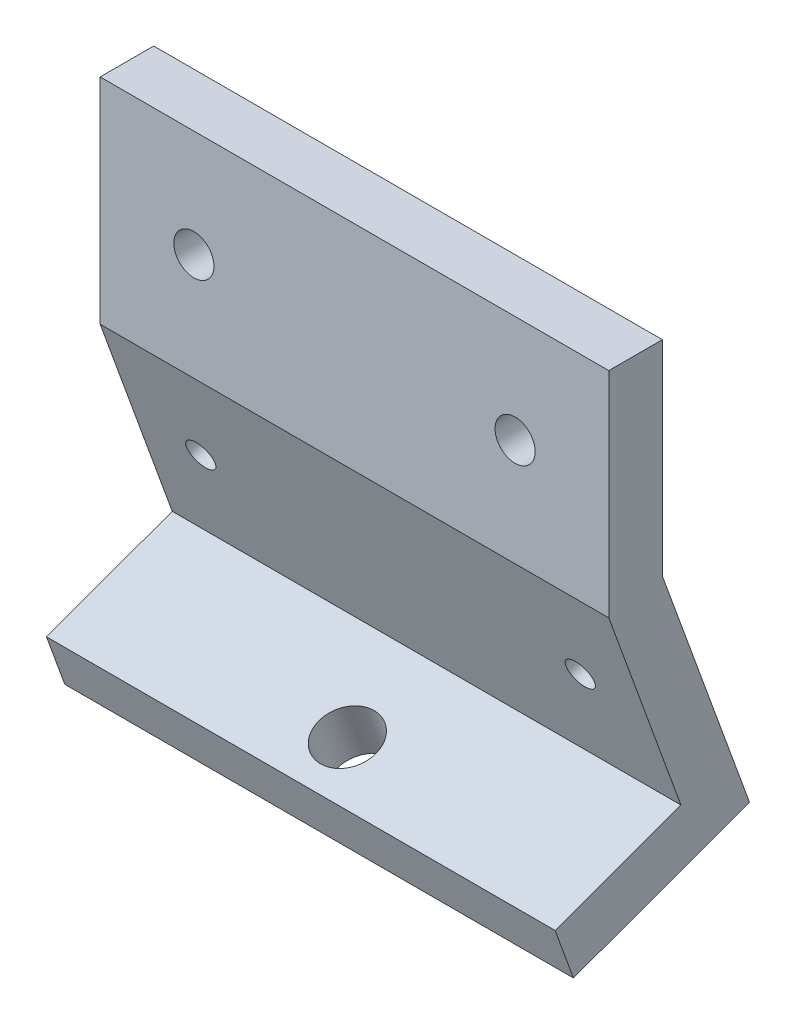
ISO-10303-21;
HEADER;
FILE_DESCRIPTION(('STEP AP214'),'2;1');
FILE_NAME('part.step','',(''),(''),'','','');
FILE_SCHEMA(('AUTOMOTIVE_DESIGN { 1 0 10303 214 1 1 1 1 }'));
ENDSEC;
DATA;
#1=APPLICATION_CONTEXT('core data for automotive mechanical design processes');
#2=APPLICATION_PROTOCOL_DEFINITION('international standard','automotive_design',2000,#1);
#3=PRODUCT_CONTEXT('',#1,'mechanical');
#4=PRODUCT('Part','Part','',(#3));
#5=PRODUCT_RELATED_PRODUCT_CATEGORY('part','',(#4));
#6=PRODUCT_DEFINITION_FORMATION('','',#4);
#7=PRODUCT_DEFINITION_CONTEXT('part definition',#1,'design');
#8=PRODUCT_DEFINITION('design','',#6,#7);
#9=PRODUCT_DEFINITION_SHAPE('','',#8);
#10=(LENGTH_UNIT() NAMED_UNIT(*) SI_UNIT(.MILLI.,.METRE.));
#11=(NAMED_UNIT(*) PLANE_ANGLE_UNIT() SI_UNIT($,.RADIAN.));
#12=(NAMED_UNIT(*) SI_UNIT($,.STERADIAN.) SOLID_ANGLE_UNIT());
#13=UNCERTAINTY_MEASURE_WITH_UNIT(LENGTH_MEASURE(1.E-05),#10,'distance_accuracy_value','');
#14=(GEOMETRIC_REPRESENTATION_CONTEXT(3) GLOBAL_UNCERTAINTY_ASSIGNED_CONTEXT((#13)) GLOBAL_UNIT_ASSIGNED_CONTEXT((#10,
#11,#12)) REPRESENTATION_CONTEXT('',''));
#15=CARTESIAN_POINT('',(0.,0.,0.));
#16=DIRECTION('',(0.,0.,1.));
#17=DIRECTION('',(1.,0.,0.));
#18=AXIS2_PLACEMENT_3D('',#15,#16,#17);
#19=CARTESIAN_POINT('',(30.1625,0.,0.));
#20=DIRECTION('',(0.,0.,-1.));
#21=DIRECTION('',(-1.,0.,0.));
#22=AXIS2_PLACEMENT_3D('',#19,#20,#21);
#23=PLANE('',#22);
#24=CARTESIAN_POINT('',(19.05,12.7,0.));
#25=DIRECTION('',(0.,0.,1.));
#26=DIRECTION('',(1.,0.,0.));
#27=AXIS2_PLACEMENT_3D('',#24,#25,#26);
#28=CIRCLE('',#27,2.38124999999999);
#29=CARTESIAN_POINT('',(21.43125,12.7,0.));
#30=VERTEX_POINT('',#29);
#31=EDGE_CURVE('E235',#30,#30,#28,.T.);
#32=ORIENTED_EDGE('',*,*,#31,.F.);
#33=EDGE_LOOP('',(#32));
#34=FACE_BOUND('',#33,.T.);
#35=DIRECTION('',(0.,-1.,0.));
#36=VECTOR('',#35,1.);
#37=CARTESIAN_POINT('',(-30.1625,0.,0.));
#38=LINE('',#37,#36);
#39=CARTESIAN_POINT('',(-30.1625,25.4,0.));
#40=VERTEX_POINT('',#39);
#41=CARTESIAN_POINT('',(-30.1625,0.,0.));
#42=VERTEX_POINT('',#41);
#43=EDGE_CURVE('E92',#40,#42,#38,.T.);
#44=ORIENTED_EDGE('',*,*,#43,.T.);
#45=DIRECTION('',(-1.,0.,0.));
#46=VECTOR('',#45,1.);
#47=CARTESIAN_POINT('',(30.1625,0.,0.));
#48=LINE('',#47,#46);
#49=CARTESIAN_POINT('',(30.1625,0.,0.));
#50=VERTEX_POINT('',#49);
#51=EDGE_CURVE('E137',#50,#42,#48,.T.);
#52=ORIENTED_EDGE('',*,*,#51,.F.);
#53=DIRECTION('',(0.,-1.,0.));
#54=VECTOR('',#53,1.);
#55=CARTESIAN_POINT('',(30.1625,0.,0.));
#56=LINE('',#55,#54);
#57=CARTESIAN_POINT('',(30.1625,25.4,0.));
#58=VERTEX_POINT('',#57);
#59=EDGE_CURVE('E57',#58,#50,#56,.T.);
#60=ORIENTED_EDGE('',*,*,#59,.F.);
#61=DIRECTION('',(-1.,0.,0.));
#62=VECTOR('',#61,1.);
#63=CARTESIAN_POINT('',(30.1625,25.4,0.));
#64=LINE('',#63,#62);
#65=EDGE_CURVE('E131',#58,#40,#64,.T.);
#66=ORIENTED_EDGE('',*,*,#65,.T.);
#67=EDGE_LOOP('',(#44,#52,#60,#66));
#68=FACE_BOUND('',#67,.T.);
#69=CARTESIAN_POINT('',(-19.05,12.7,0.));
#70=DIRECTION('',(0.,0.,1.));
#71=DIRECTION('',(1.,0.,0.));
#72=AXIS2_PLACEMENT_3D('',#69,#70,#71);
#73=CIRCLE('',#72,2.38124999999999);
#74=CARTESIAN_POINT('',(-16.66875,12.7,0.));
#75=VERTEX_POINT('',#74);
#76=EDGE_CURVE('E243',#75,#75,#73,.T.);
#77=ORIENTED_EDGE('',*,*,#76,.F.);
#78=EDGE_LOOP('',(#77));
#79=FACE_BOUND('',#78,.T.);
#80=ADVANCED_FACE('F39',(#34,#68,#79),#23,.F.);
#81=CARTESIAN_POINT('',(30.1625,-23.4923155196477,-8.55050358314173));
#82=DIRECTION('',(0.,0.342020143325669,-0.939692620785908));
#83=DIRECTION('',(0.,0.939692620785908,0.342020143325669));
#84=AXIS2_PLACEMENT_3D('',#81,#82,#83);
#85=PLANE('',#84);
#86=CARTESIAN_POINT('',(-22.5,-11.7461577598239,-4.27525179157087));
#87=DIRECTION('',(0.,-0.342020143325669,0.939692620785908));
#88=DIRECTION('',(0.,-0.939692620785908,-0.342020143325669));
#89=AXIS2_PLACEMENT_3D('',#86,#87,#88);
#90=CIRCLE('',#89,1.7);
#91=CARTESIAN_POINT('',(-22.5,-13.3436352151599,-4.85668603522451));
#92=VERTEX_POINT('',#91);
#93=EDGE_CURVE('E227',#92,#92,#90,.T.);
#94=ORIENTED_EDGE('',*,*,#93,.F.);
#95=EDGE_LOOP('',(#94));
#96=FACE_BOUND('',#95,.T.);
#97=DIRECTION('',(0.,-0.939692620785908,-0.342020143325669));
#98=VECTOR('',#97,1.);
#99=CARTESIAN_POINT('',(-30.1625,-23.4923155196477,-8.55050358314173));
#100=LINE('',#99,#98);
#101=CARTESIAN_POINT('',(-30.1625,-23.4923155196477,-8.55050358314173));
#102=VERTEX_POINT('',#101);
#103=EDGE_CURVE('E141',#42,#102,#100,.T.);
#104=ORIENTED_EDGE('',*,*,#103,.T.);
#105=DIRECTION('',(-1.,0.,0.));
#106=VECTOR('',#105,1.);
#107=CARTESIAN_POINT('',(30.1625,-23.4923155196477,-8.55050358314173));
#108=LINE('',#107,#106);
#109=CARTESIAN_POINT('',(30.1625,-23.4923155196477,-8.55050358314173));
#110=VERTEX_POINT('',#109);
#111=EDGE_CURVE('E11',#110,#102,#108,.T.);
#112=ORIENTED_EDGE('',*,*,#111,.F.);
#113=DIRECTION('',(0.,-0.939692620785908,-0.342020143325669));
#114=VECTOR('',#113,1.);
#115=CARTESIAN_POINT('',(30.1625,-23.4923155196477,-8.55050358314173));
#116=LINE('',#115,#114);
#117=EDGE_CURVE('E164',#50,#110,#116,.T.);
#118=ORIENTED_EDGE('',*,*,#117,.F.);
#119=ORIENTED_EDGE('',*,*,#51,.T.);
#120=EDGE_LOOP('',(#104,#112,#118,#119));
#121=FACE_BOUND('',#120,.T.);
#122=CARTESIAN_POINT('',(22.5,-11.7461577598239,-4.27525179157087));
#123=DIRECTION('',(0.,-0.342020143325669,0.939692620785908));
#124=DIRECTION('',(0.,-0.939692620785908,-0.342020143325669));
#125=AXIS2_PLACEMENT_3D('',#122,#123,#124);
#126=CIRCLE('',#125,1.7);
#127=CARTESIAN_POINT('',(22.5,-13.3436352151599,-4.85668603522451));
#128=VERTEX_POINT('',#127);
#129=EDGE_CURVE('E219',#128,#128,#126,.T.);
#130=ORIENTED_EDGE('',*,*,#129,.F.);
#131=EDGE_LOOP('',(#130));
#132=FACE_BOUND('',#131,.T.);
#133=ADVANCED_FACE('F41',(#96,#121,#132),#85,.F.);
#134=CARTESIAN_POINT('',(30.1625,-28.9218852949427,6.36711677183456));
#135=DIRECTION('',(0.,-0.939692620785908,-0.34202014332567));
#136=DIRECTION('',(0.,0.34202014332567,-0.939692620785908));
#137=AXIS2_PLACEMENT_3D('',#134,#135,#136);
#138=PLANE('',#137);
#139=DIRECTION('',(0.,-0.34202014332567,0.939692620785908));
#140=VECTOR('',#139,1.);
#141=CARTESIAN_POINT('',(-30.1625,-28.9218852949427,6.36711677183456));
#142=LINE('',#141,#140);
#143=CARTESIAN_POINT('',(-30.1625,-28.9218852949427,6.36711677183456));
#144=VERTEX_POINT('',#143);
#145=EDGE_CURVE('E145',#102,#144,#142,.T.);
#146=ORIENTED_EDGE('',*,*,#145,.T.);
#147=DIRECTION('',(-1.,0.,0.));
#148=VECTOR('',#147,1.);
#149=CARTESIAN_POINT('',(30.1625,-28.9218852949427,6.36711677183456));
#150=LINE('',#149,#148);
#151=CARTESIAN_POINT('',(30.1625,-28.9218852949427,6.36711677183456));
#152=VERTEX_POINT('',#151);
#153=EDGE_CURVE('E49',#152,#144,#150,.T.);
#154=ORIENTED_EDGE('',*,*,#153,.F.);
#155=DIRECTION('',(0.,-0.34202014332567,0.939692620785908));
#156=VECTOR('',#155,1.);
#157=CARTESIAN_POINT('',(30.1625,-28.9218852949427,6.36711677183456));
#158=LINE('',#157,#156);
#159=EDGE_CURVE('E100',#110,#152,#158,.T.);
#160=ORIENTED_EDGE('',*,*,#159,.F.);
#161=ORIENTED_EDGE('',*,*,#111,.T.);
#162=EDGE_LOOP('',(#146,#154,#160,#161));
#163=FACE_BOUND('',#162,.T.);
#164=CARTESIAN_POINT('',(0.,-26.9125169529044,0.846422624717355));
#165=DIRECTION('',(0.,0.939692620785908,0.34202014332567));
#166=DIRECTION('',(0.,-0.34202014332567,0.939692620785908));
#167=AXIS2_PLACEMENT_3D('',#164,#165,#166);
#168=CIRCLE('',#167,3.37819999999999);
#169=CARTESIAN_POINT('',(0.,-28.0679294010872,4.0208922362563));
#170=VERTEX_POINT('',#169);
#171=EDGE_CURVE('E211',#170,#170,#168,.T.);
#172=ORIENTED_EDGE('',*,*,#171,.F.);
#173=EDGE_LOOP('',(#172));
#174=FACE_BOUND('',#173,.T.);
#175=ADVANCED_FACE('F256',(#163,#174),#138,.F.);
#176=CARTESIAN_POINT('',(30.1625,-34.8889334369332,4.19528886171655));
#177=DIRECTION('',(0.,0.34202014332567,-0.939692620785908));
#178=DIRECTION('',(0.,0.939692620785908,0.34202014332567));
#179=AXIS2_PLACEMENT_3D('',#176,#177,#178);
#180=PLANE('',#179);
#181=DIRECTION('',(0.,-0.939692620785908,-0.34202014332567));
#182=VECTOR('',#181,1.);
#183=CARTESIAN_POINT('',(-30.1625,-34.8889334369332,4.19528886171655));
#184=LINE('',#183,#182);
#185=CARTESIAN_POINT('',(-30.1625,-34.8889334369332,4.19528886171655));
#186=VERTEX_POINT('',#185);
#187=EDGE_CURVE('E149',#144,#186,#184,.T.);
#188=ORIENTED_EDGE('',*,*,#187,.T.);
#189=DIRECTION('',(-1.,0.,0.));
#190=VECTOR('',#189,1.);
#191=CARTESIAN_POINT('',(30.1625,-34.8889334369332,4.19528886171655));
#192=LINE('',#191,#190);
#193=CARTESIAN_POINT('',(30.1625,-34.8889334369332,4.19528886171655));
#194=VERTEX_POINT('',#193);
#195=EDGE_CURVE('E175',#194,#186,#192,.T.);
#196=ORIENTED_EDGE('',*,*,#195,.F.);
#197=DIRECTION('',(0.,-0.939692620785908,-0.34202014332567));
#198=VECTOR('',#197,1.);
#199=CARTESIAN_POINT('',(30.1625,-34.8889334369332,4.19528886171655));
#200=LINE('',#199,#198);
#201=EDGE_CURVE('E185',#152,#194,#200,.T.);
#202=ORIENTED_EDGE('',*,*,#201,.F.);
#203=ORIENTED_EDGE('',*,*,#153,.T.);
#204=EDGE_LOOP('',(#188,#196,#202,#203));
#205=FACE_BOUND('',#204,.T.);
#206=ADVANCED_FACE('F183',(#205),#180,.F.);
#207=CARTESIAN_POINT('',(30.1625,-27.2875357515202,-16.6893796352503));
#208=DIRECTION('',(0.,0.939692620785908,0.34202014332567));
#209=DIRECTION('',(0.,-0.34202014332567,0.939692620785908));
#210=AXIS2_PLACEMENT_3D('',#207,#208,#209);
#211=PLANE('',#210);
#212=CARTESIAN_POINT('',(0.,-32.8795650948949,-1.32540528540065));
#213=DIRECTION('',(0.,0.939692620785908,0.34202014332567));
#214=DIRECTION('',(0.,-0.34202014332567,0.939692620785908));
#215=AXIS2_PLACEMENT_3D('',#212,#213,#214);
#216=CIRCLE('',#215,3.37819999999999);
#217=CARTESIAN_POINT('',(0.,-34.0349775430777,1.8490643261383));
#218=VERTEX_POINT('',#217);
#219=EDGE_CURVE('E146',#218,#218,#216,.T.);
#220=ORIENTED_EDGE('',*,*,#219,.T.);
#221=EDGE_LOOP('',(#220));
#222=FACE_BOUND('',#221,.T.);
#223=DIRECTION('',(0.,0.342020143325669,-0.939692620785908));
#224=VECTOR('',#223,1.);
#225=CARTESIAN_POINT('',(-30.1625,-27.2875357515202,-16.6893796352503));
#226=LINE('',#225,#224);
#227=CARTESIAN_POINT('',(-30.1625,-27.2875357515202,-16.6893796352503));
#228=VERTEX_POINT('',#227);
#229=EDGE_CURVE('E152',#186,#228,#226,.T.);
#230=ORIENTED_EDGE('',*,*,#229,.T.);
#231=DIRECTION('',(-1.,0.,0.));
#232=VECTOR('',#231,1.);
#233=CARTESIAN_POINT('',(30.1625,-27.2875357515202,-16.6893796352503));
#234=LINE('',#233,#232);
#235=CARTESIAN_POINT('',(30.1625,-27.2875357515202,-16.6893796352503));
#236=VERTEX_POINT('',#235);
#237=EDGE_CURVE('E171',#236,#228,#234,.T.);
#238=ORIENTED_EDGE('',*,*,#237,.F.);
#239=DIRECTION('',(0.,0.342020143325669,-0.939692620785908));
#240=VECTOR('',#239,1.);
#241=CARTESIAN_POINT('',(30.1625,-27.2875357515202,-16.6893796352503));
#242=LINE('',#241,#240);
#243=EDGE_CURVE('E198',#194,#236,#242,.T.);
#244=ORIENTED_EDGE('',*,*,#243,.F.);
#245=ORIENTED_EDGE('',*,*,#195,.T.);
#246=EDGE_LOOP('',(#230,#238,#244,#245));
#247=FACE_BOUND('',#246,.T.);
#248=ADVANCED_FACE('F193',(#222,#247),#211,.F.);
#249=CARTESIAN_POINT('',(30.1625,1.11967632749875,-6.35));
#250=DIRECTION('',(0.,-0.34202014332567,0.939692620785908));
#251=DIRECTION('',(0.,-0.939692620785908,-0.34202014332567));
#252=AXIS2_PLACEMENT_3D('',#249,#250,#251);
#253=PLANE('',#252);
#254=CARTESIAN_POINT('',(-22.5,-9.57432984970586,-10.2422999335614));
#255=DIRECTION('',(0.,-0.34202014332567,0.939692620785908));
#256=DIRECTION('',(0.,-0.939692620785908,-0.34202014332567));
#257=AXIS2_PLACEMENT_3D('',#254,#255,#256);
#258=CIRCLE('',#257,1.7);
#259=CARTESIAN_POINT('',(-22.5,-11.1718073050419,-10.823734177215));
#260=VERTEX_POINT('',#259);
#261=EDGE_CURVE('E223',#260,#260,#258,.T.);
#262=ORIENTED_EDGE('',*,*,#261,.T.);
#263=EDGE_LOOP('',(#262));
#264=FACE_BOUND('',#263,.T.);
#265=CARTESIAN_POINT('',(22.5,-9.57432984970586,-10.2422999335614));
#266=DIRECTION('',(0.,-0.34202014332567,0.939692620785908));
#267=DIRECTION('',(0.,-0.939692620785908,-0.34202014332567));
#268=AXIS2_PLACEMENT_3D('',#265,#266,#267);
#269=CIRCLE('',#268,1.7);
#270=CARTESIAN_POINT('',(22.5,-11.1718073050419,-10.823734177215));
#271=VERTEX_POINT('',#270);
#272=EDGE_CURVE('E215',#271,#271,#269,.T.);
#273=ORIENTED_EDGE('',*,*,#272,.T.);
#274=EDGE_LOOP('',(#273));
#275=FACE_BOUND('',#274,.T.);
#276=DIRECTION('',(0.,0.939692620785908,0.34202014332567));
#277=VECTOR('',#276,1.);
#278=CARTESIAN_POINT('',(-30.1625,1.11967632749875,-6.35));
#279=LINE('',#278,#277);
#280=CARTESIAN_POINT('',(-30.1625,1.11967632749875,-6.35));
#281=VERTEX_POINT('',#280);
#282=EDGE_CURVE('E155',#228,#281,#279,.T.);
#283=ORIENTED_EDGE('',*,*,#282,.T.);
#284=DIRECTION('',(-1.,0.,0.));
#285=VECTOR('',#284,1.);
#286=CARTESIAN_POINT('',(30.1625,1.11967632749875,-6.35));
#287=LINE('',#286,#285);
#288=CARTESIAN_POINT('',(30.1625,1.11967632749875,-6.35));
#289=VERTEX_POINT('',#288);
#290=EDGE_CURVE('E130',#289,#281,#287,.T.);
#291=ORIENTED_EDGE('',*,*,#290,.F.);
#292=DIRECTION('',(0.,0.939692620785908,0.34202014332567));
#293=VECTOR('',#292,1.);
#294=CARTESIAN_POINT('',(30.1625,1.11967632749875,-6.35));
#295=LINE('',#294,#293);
#296=EDGE_CURVE('E119',#236,#289,#295,.T.);
#297=ORIENTED_EDGE('',*,*,#296,.F.);
#298=ORIENTED_EDGE('',*,*,#237,.T.);
#299=EDGE_LOOP('',(#283,#291,#297,#298));
#300=FACE_BOUND('',#299,.T.);
#301=ADVANCED_FACE('F196',(#264,#275,#300),#253,.F.);
#302=CARTESIAN_POINT('',(30.1625,25.4,-6.35));
#303=DIRECTION('',(0.,0.,1.));
#304=DIRECTION('',(0.,-1.,0.));
#305=AXIS2_PLACEMENT_3D('',#302,#303,#304);
#306=PLANE('',#305);
#307=CARTESIAN_POINT('',(-19.05,12.7,-6.35));
#308=DIRECTION('',(0.,0.,1.));
#309=DIRECTION('',(0.,-1.,0.));
#310=AXIS2_PLACEMENT_3D('',#307,#308,#309);
#311=CIRCLE('',#310,2.38124999999999);
#312=CARTESIAN_POINT('',(-19.05,10.31875,-6.35));
#313=VERTEX_POINT('',#312);
#314=EDGE_CURVE('E239',#313,#313,#311,.T.);
#315=ORIENTED_EDGE('',*,*,#314,.T.);
#316=EDGE_LOOP('',(#315));
#317=FACE_BOUND('',#316,.T.);
#318=CARTESIAN_POINT('',(19.05,12.7,-6.35));
#319=DIRECTION('',(0.,0.,1.));
#320=DIRECTION('',(0.,-1.,0.));
#321=AXIS2_PLACEMENT_3D('',#318,#319,#320);
#322=CIRCLE('',#321,2.38124999999999);
#323=CARTESIAN_POINT('',(19.05,10.31875,-6.35));
#324=VERTEX_POINT('',#323);
#325=EDGE_CURVE('E231',#324,#324,#322,.T.);
#326=ORIENTED_EDGE('',*,*,#325,.T.);
#327=EDGE_LOOP('',(#326));
#328=FACE_BOUND('',#327,.T.);
#329=DIRECTION('',(0.,1.,0.));
#330=VECTOR('',#329,1.);
#331=CARTESIAN_POINT('',(-30.1625,25.4,-6.35));
#332=LINE('',#331,#330);
#333=CARTESIAN_POINT('',(-30.1625,25.4,-6.35));
#334=VERTEX_POINT('',#333);
#335=EDGE_CURVE('E128',#281,#334,#332,.T.);
#336=ORIENTED_EDGE('',*,*,#335,.T.);
#337=DIRECTION('',(-1.,0.,0.));
#338=VECTOR('',#337,1.);
#339=CARTESIAN_POINT('',(30.1625,25.4,-6.35));
#340=LINE('',#339,#338);
#341=CARTESIAN_POINT('',(30.1625,25.4,-6.35));
#342=VERTEX_POINT('',#341);
#343=EDGE_CURVE('E125',#342,#334,#340,.T.);
#344=ORIENTED_EDGE('',*,*,#343,.F.);
#345=DIRECTION('',(0.,1.,0.));
#346=VECTOR('',#345,1.);
#347=CARTESIAN_POINT('',(30.1625,25.4,-6.35));
#348=LINE('',#347,#346);
#349=EDGE_CURVE('E113',#289,#342,#348,.T.);
#350=ORIENTED_EDGE('',*,*,#349,.F.);
#351=ORIENTED_EDGE('',*,*,#290,.T.);
#352=EDGE_LOOP('',(#336,#344,#350,#351));
#353=FACE_BOUND('',#352,.T.);
#354=ADVANCED_FACE('F126',(#317,#328,#353),#306,.F.);
#355=CARTESIAN_POINT('',(30.1625,25.4,0.));
#356=DIRECTION('',(0.,-1.,0.));
#357=DIRECTION('',(0.,0.,-1.));
#358=AXIS2_PLACEMENT_3D('',#355,#356,#357);
#359=PLANE('',#358);
#360=DIRECTION('',(0.,0.,1.));
#361=VECTOR('',#360,1.);
#362=CARTESIAN_POINT('',(-30.1625,25.4,0.));
#363=LINE('',#362,#361);
#364=EDGE_CURVE('E86',#334,#40,#363,.T.);
#365=ORIENTED_EDGE('',*,*,#364,.T.);
#366=ORIENTED_EDGE('',*,*,#65,.F.);
#367=DIRECTION('',(0.,0.,1.));
#368=VECTOR('',#367,1.);
#369=CARTESIAN_POINT('',(30.1625,25.4,0.));
#370=LINE('',#369,#368);
#371=EDGE_CURVE('E117',#342,#58,#370,.T.);
#372=ORIENTED_EDGE('',*,*,#371,.F.);
#373=ORIENTED_EDGE('',*,*,#343,.T.);
#374=EDGE_LOOP('',(#365,#366,#372,#373));
#375=FACE_BOUND('',#374,.T.);
#376=ADVANCED_FACE('F133',(#375),#359,.F.);
#377=CARTESIAN_POINT('',(30.1625,0.,0.));
#378=DIRECTION('',(1.,0.,0.));
#379=DIRECTION('',(0.,0.,-1.));
#380=AXIS2_PLACEMENT_3D('',#377,#378,#379);
#381=PLANE('',#380);
#382=ORIENTED_EDGE('',*,*,#117,.T.);
#383=ORIENTED_EDGE('',*,*,#159,.T.);
#384=ORIENTED_EDGE('',*,*,#201,.T.);
#385=ORIENTED_EDGE('',*,*,#243,.T.);
#386=ORIENTED_EDGE('',*,*,#296,.T.);
#387=ORIENTED_EDGE('',*,*,#349,.T.);
#388=ORIENTED_EDGE('',*,*,#371,.T.);
#389=ORIENTED_EDGE('',*,*,#59,.T.);
#390=EDGE_LOOP('',(#382,#383,#384,#385,#386,#387,#388,#389));
#391=FACE_BOUND('',#390,.T.);
#392=ADVANCED_FACE('F115',(#391),#381,.T.);
#393=CARTESIAN_POINT('',(-30.1625,0.,0.));
#394=DIRECTION('',(1.,0.,0.));
#395=DIRECTION('',(0.,0.,-1.));
#396=AXIS2_PLACEMENT_3D('',#393,#394,#395);
#397=PLANE('',#396);
#398=ORIENTED_EDGE('',*,*,#103,.F.);
#399=ORIENTED_EDGE('',*,*,#43,.F.);
#400=ORIENTED_EDGE('',*,*,#364,.F.);
#401=ORIENTED_EDGE('',*,*,#335,.F.);
#402=ORIENTED_EDGE('',*,*,#282,.F.);
#403=ORIENTED_EDGE('',*,*,#229,.F.);
#404=ORIENTED_EDGE('',*,*,#187,.F.);
#405=ORIENTED_EDGE('',*,*,#145,.F.);
#406=EDGE_LOOP('',(#398,#399,#400,#401,#402,#403,#404,#405));
#407=FACE_BOUND('',#406,.T.);
#408=ADVANCED_FACE('F189',(#407),#397,.F.);
#409=CARTESIAN_POINT('',(0.,-26.9125169529044,0.846422624717355));
#410=DIRECTION('',(0.,0.939692620785908,0.34202014332567));
#411=DIRECTION('',(0.,-0.34202014332567,0.939692620785908));
#412=AXIS2_PLACEMENT_3D('',#409,#410,#411);
#413=CYLINDRICAL_SURFACE('',#412,3.37819999999999);
#414=ORIENTED_EDGE('',*,*,#219,.F.);
#415=EDGE_LOOP('',(#414));
#416=FACE_BOUND('',#415,.T.);
#417=ORIENTED_EDGE('',*,*,#171,.T.);
#418=EDGE_LOOP('',(#417));
#419=FACE_BOUND('',#418,.T.);
#420=ADVANCED_FACE('F280',(#416,#419),#413,.F.);
#421=CARTESIAN_POINT('',(22.5,-11.7461577598239,-4.27525179157087));
#422=DIRECTION('',(0.,-0.342020143325669,0.939692620785908));
#423=DIRECTION('',(0.,-0.939692620785908,-0.342020143325669));
#424=AXIS2_PLACEMENT_3D('',#421,#422,#423);
#425=CYLINDRICAL_SURFACE('',#424,1.7);
#426=ORIENTED_EDGE('',*,*,#272,.F.);
#427=EDGE_LOOP('',(#426));
#428=FACE_BOUND('',#427,.T.);
#429=ORIENTED_EDGE('',*,*,#129,.T.);
#430=EDGE_LOOP('',(#429));
#431=FACE_BOUND('',#430,.T.);
#432=ADVANCED_FACE('F282',(#428,#431),#425,.F.);
#433=CARTESIAN_POINT('',(-22.5,-11.7461577598239,-4.27525179157087));
#434=DIRECTION('',(0.,-0.342020143325669,0.939692620785908));
#435=DIRECTION('',(0.,-0.939692620785908,-0.342020143325669));
#436=AXIS2_PLACEMENT_3D('',#433,#434,#435);
#437=CYLINDRICAL_SURFACE('',#436,1.7);
#438=ORIENTED_EDGE('',*,*,#261,.F.);
#439=EDGE_LOOP('',(#438));
#440=FACE_BOUND('',#439,.T.);
#441=ORIENTED_EDGE('',*,*,#93,.T.);
#442=EDGE_LOOP('',(#441));
#443=FACE_BOUND('',#442,.T.);
#444=ADVANCED_FACE('F289',(#440,#443),#437,.F.);
#445=CARTESIAN_POINT('',(19.05,12.7,0.));
#446=DIRECTION('',(0.,0.,1.));
#447=DIRECTION('',(1.,0.,0.));
#448=AXIS2_PLACEMENT_3D('',#445,#446,#447);
#449=CYLINDRICAL_SURFACE('',#448,2.38124999999999);
#450=ORIENTED_EDGE('',*,*,#325,.F.);
#451=EDGE_LOOP('',(#450));
#452=FACE_BOUND('',#451,.T.);
#453=ORIENTED_EDGE('',*,*,#31,.T.);
#454=EDGE_LOOP('',(#453));
#455=FACE_BOUND('',#454,.T.);
#456=ADVANCED_FACE('F345',(#452,#455),#449,.F.);
#457=CARTESIAN_POINT('',(-19.05,12.7,0.));
#458=DIRECTION('',(0.,0.,1.));
#459=DIRECTION('',(1.,0.,0.));
#460=AXIS2_PLACEMENT_3D('',#457,#458,#459);
#461=CYLINDRICAL_SURFACE('',#460,2.38124999999999);
#462=ORIENTED_EDGE('',*,*,#314,.F.);
#463=EDGE_LOOP('',(#462));
#464=FACE_BOUND('',#463,.T.);
#465=ORIENTED_EDGE('',*,*,#76,.T.);
#466=EDGE_LOOP('',(#465));
#467=FACE_BOUND('',#466,.T.);
#468=ADVANCED_FACE('F248',(#464,#467),#461,.F.);
#469=CLOSED_SHELL('',(#80,#133,#175,#206,#248,#301,#354,#376,#392,#408,#420,#432,#444,#456,#468));
#470=MANIFOLD_SOLID_BREP('B2',#469);
#471=ADVANCED_BREP_SHAPE_REPRESENTATION('',(#18,#470),#14);
#472=SHAPE_DEFINITION_REPRESENTATION(#9,#471);
ENDSEC;
END-ISO-10303-21;
